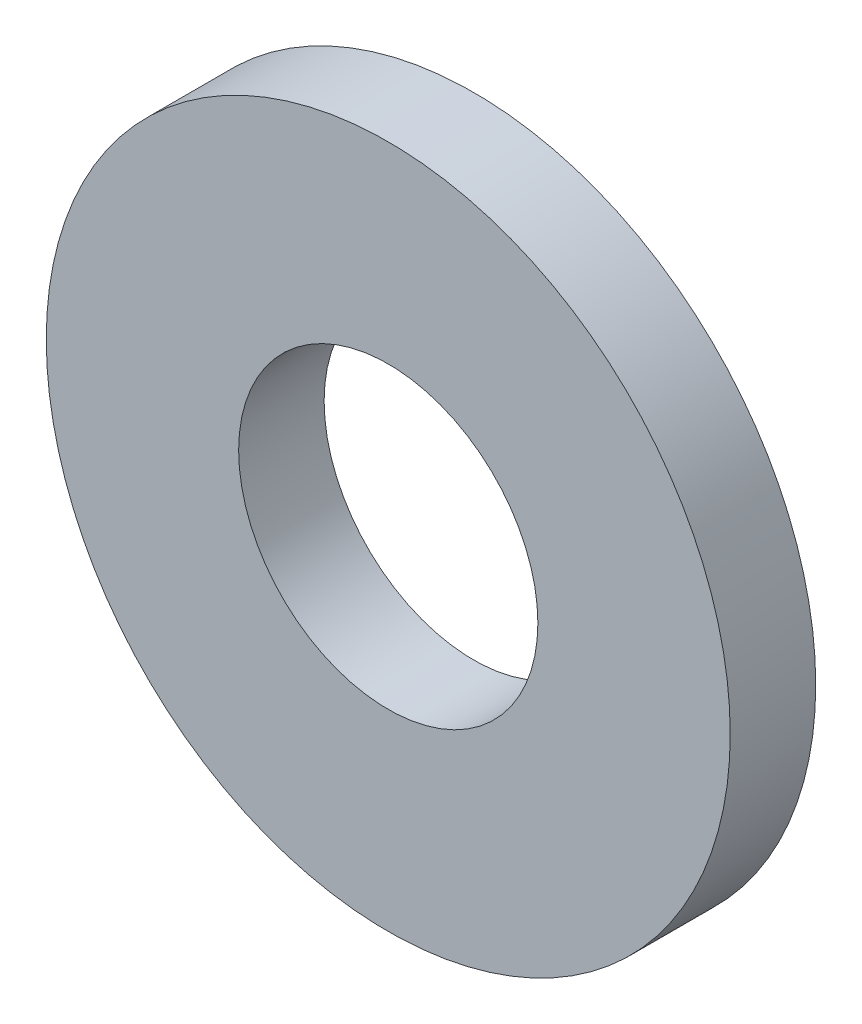
ISO-10303-21;
HEADER;
FILE_DESCRIPTION(('STEP AP214'),'2;1');
FILE_NAME('part.step','',(''),(''),'','','');
FILE_SCHEMA(('AUTOMOTIVE_DESIGN { 1 0 10303 214 1 1 1 1 }'));
ENDSEC;
DATA;
#1=APPLICATION_CONTEXT('core data for automotive mechanical design processes');
#2=APPLICATION_PROTOCOL_DEFINITION('international standard','automotive_design',2000,#1);
#3=PRODUCT_CONTEXT('',#1,'mechanical');
#4=PRODUCT('Part','Part','',(#3));
#5=PRODUCT_RELATED_PRODUCT_CATEGORY('part','',(#4));
#6=PRODUCT_DEFINITION_FORMATION('','',#4);
#7=PRODUCT_DEFINITION_CONTEXT('part definition',#1,'design');
#8=PRODUCT_DEFINITION('design','',#6,#7);
#9=PRODUCT_DEFINITION_SHAPE('','',#8);
#10=(LENGTH_UNIT() NAMED_UNIT(*) SI_UNIT(.MILLI.,.METRE.));
#11=(NAMED_UNIT(*) PLANE_ANGLE_UNIT() SI_UNIT($,.RADIAN.));
#12=(NAMED_UNIT(*) SI_UNIT($,.STERADIAN.) SOLID_ANGLE_UNIT());
#13=UNCERTAINTY_MEASURE_WITH_UNIT(LENGTH_MEASURE(1.E-05),#10,'distance_accuracy_value','');
#14=(GEOMETRIC_REPRESENTATION_CONTEXT(3) GLOBAL_UNCERTAINTY_ASSIGNED_CONTEXT((#13)) GLOBAL_UNIT_ASSIGNED_CONTEXT((#10,
#11,#12)) REPRESENTATION_CONTEXT('',''));
#15=CARTESIAN_POINT('',(0.,0.,0.));
#16=DIRECTION('',(0.,0.,1.));
#17=DIRECTION('',(1.,0.,0.));
#18=AXIS2_PLACEMENT_3D('',#15,#16,#17);
#19=CARTESIAN_POINT('',(0.,0.,2.));
#20=DIRECTION('',(0.,0.,1.));
#21=DIRECTION('',(1.,0.,0.));
#22=AXIS2_PLACEMENT_3D('',#19,#20,#21);
#23=PLANE('',#22);
#24=CARTESIAN_POINT('',(0.,0.,2.));
#25=DIRECTION('',(0.,0.,1.));
#26=DIRECTION('',(1.,0.,0.));
#27=AXIS2_PLACEMENT_3D('',#24,#25,#26);
#28=CIRCLE('',#27,8.);
#29=CARTESIAN_POINT('',(8.,0.,2.));
#30=VERTEX_POINT('',#29);
#31=EDGE_CURVE('E10',#30,#30,#28,.T.);
#32=ORIENTED_EDGE('',*,*,#31,.T.);
#33=EDGE_LOOP('',(#32));
#34=FACE_BOUND('',#33,.T.);
#35=CARTESIAN_POINT('',(0.,0.,2.));
#36=DIRECTION('',(0.,0.,1.));
#37=DIRECTION('',(1.,0.,0.));
#38=AXIS2_PLACEMENT_3D('',#35,#36,#37);
#39=CIRCLE('',#38,3.5);
#40=CARTESIAN_POINT('',(3.5,0.,2.));
#41=VERTEX_POINT('',#40);
#42=EDGE_CURVE('E56',#41,#41,#39,.T.);
#43=ORIENTED_EDGE('',*,*,#42,.F.);
#44=EDGE_LOOP('',(#43));
#45=FACE_BOUND('',#44,.T.);
#46=ADVANCED_FACE('F43',(#34,#45),#23,.T.);
#47=CARTESIAN_POINT('',(0.,0.,0.));
#48=DIRECTION('',(0.,0.,1.));
#49=DIRECTION('',(1.,0.,0.));
#50=AXIS2_PLACEMENT_3D('',#47,#48,#49);
#51=PLANE('',#50);
#52=CARTESIAN_POINT('',(0.,0.,0.));
#53=DIRECTION('',(0.,0.,1.));
#54=DIRECTION('',(1.,0.,0.));
#55=AXIS2_PLACEMENT_3D('',#52,#53,#54);
#56=CIRCLE('',#55,8.);
#57=CARTESIAN_POINT('',(8.,0.,0.));
#58=VERTEX_POINT('',#57);
#59=EDGE_CURVE('E47',#58,#58,#56,.T.);
#60=ORIENTED_EDGE('',*,*,#59,.F.);
#61=EDGE_LOOP('',(#60));
#62=FACE_BOUND('',#61,.T.);
#63=CARTESIAN_POINT('',(0.,0.,0.));
#64=DIRECTION('',(0.,0.,1.));
#65=DIRECTION('',(1.,0.,0.));
#66=AXIS2_PLACEMENT_3D('',#63,#64,#65);
#67=CIRCLE('',#66,3.5);
#68=CARTESIAN_POINT('',(3.5,0.,0.));
#69=VERTEX_POINT('',#68);
#70=EDGE_CURVE('E58',#69,#69,#67,.T.);
#71=ORIENTED_EDGE('',*,*,#70,.T.);
#72=EDGE_LOOP('',(#71));
#73=FACE_BOUND('',#72,.T.);
#74=ADVANCED_FACE('F70',(#62,#73),#51,.F.);
#75=CARTESIAN_POINT('',(0.,0.,2.));
#76=DIRECTION('',(0.,0.,-1.));
#77=DIRECTION('',(-1.,0.,0.));
#78=AXIS2_PLACEMENT_3D('',#75,#76,#77);
#79=CYLINDRICAL_SURFACE('',#78,8.);
#80=ORIENTED_EDGE('',*,*,#31,.F.);
#81=EDGE_LOOP('',(#80));
#82=FACE_BOUND('',#81,.T.);
#83=ORIENTED_EDGE('',*,*,#59,.T.);
#84=EDGE_LOOP('',(#83));
#85=FACE_BOUND('',#84,.T.);
#86=ADVANCED_FACE('F45',(#82,#85),#79,.T.);
#87=CARTESIAN_POINT('',(0.,0.,2.));
#88=DIRECTION('',(0.,0.,-1.));
#89=DIRECTION('',(-1.,0.,0.));
#90=AXIS2_PLACEMENT_3D('',#87,#88,#89);
#91=CYLINDRICAL_SURFACE('',#90,3.5);
#92=ORIENTED_EDGE('',*,*,#42,.T.);
#93=EDGE_LOOP('',(#92));
#94=FACE_BOUND('',#93,.T.);
#95=ORIENTED_EDGE('',*,*,#70,.F.);
#96=EDGE_LOOP('',(#95));
#97=FACE_BOUND('',#96,.T.);
#98=ADVANCED_FACE('F66',(#94,#97),#91,.F.);
#99=CLOSED_SHELL('',(#46,#74,#86,#98));
#100=MANIFOLD_SOLID_BREP('B2',#99);
#101=ADVANCED_BREP_SHAPE_REPRESENTATION('',(#18,#100),#14);
#102=SHAPE_DEFINITION_REPRESENTATION(#9,#101);
ENDSEC;
END-ISO-10303-21;
